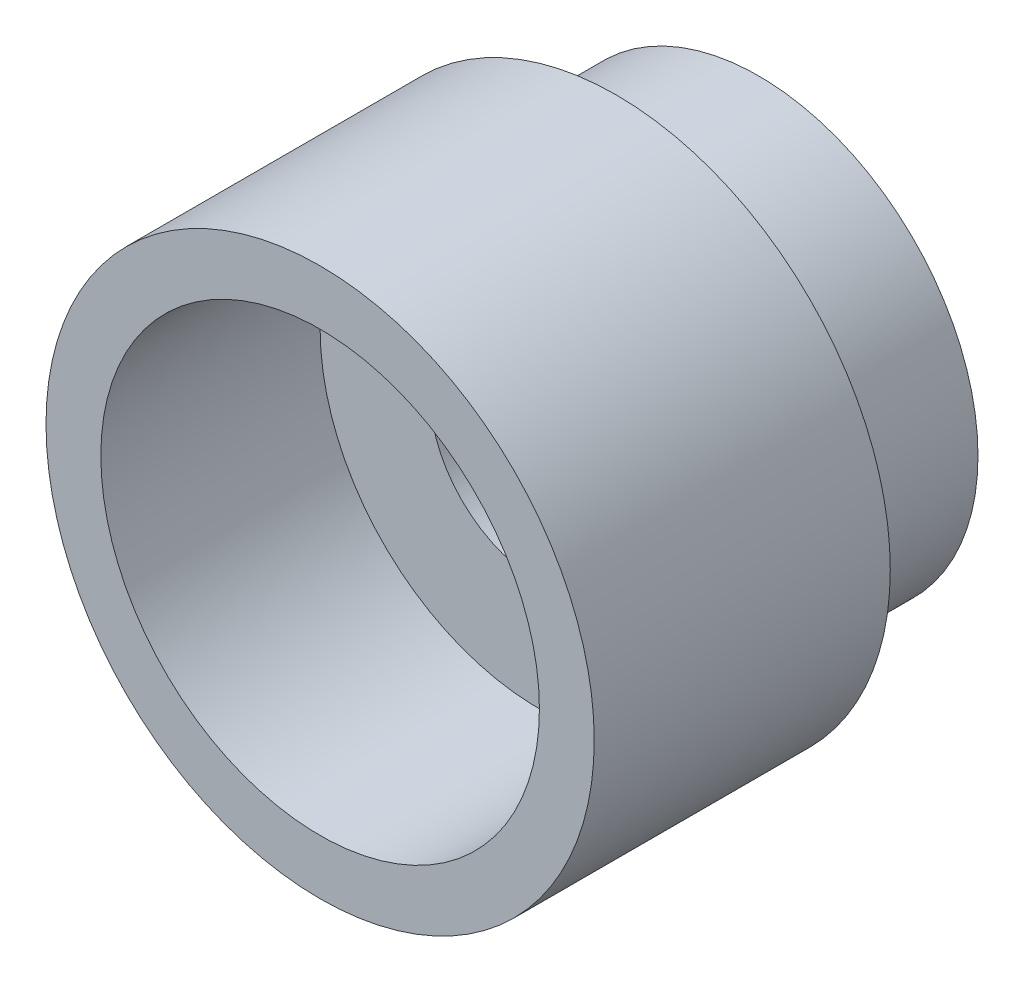
ISO-10303-21;
HEADER;
FILE_DESCRIPTION(('STEP AP214'),'2;1');
FILE_NAME('part.step','',(''),(''),'','','');
FILE_SCHEMA(('AUTOMOTIVE_DESIGN { 1 0 10303 214 1 1 1 1 }'));
ENDSEC;
DATA;
#1=APPLICATION_CONTEXT('core data for automotive mechanical design processes');
#2=APPLICATION_PROTOCOL_DEFINITION('international standard','automotive_design',2000,#1);
#3=PRODUCT_CONTEXT('',#1,'mechanical');
#4=PRODUCT('Part','Part','',(#3));
#5=PRODUCT_RELATED_PRODUCT_CATEGORY('part','',(#4));
#6=PRODUCT_DEFINITION_FORMATION('','',#4);
#7=PRODUCT_DEFINITION_CONTEXT('part definition',#1,'design');
#8=PRODUCT_DEFINITION('design','',#6,#7);
#9=PRODUCT_DEFINITION_SHAPE('','',#8);
#10=(LENGTH_UNIT() NAMED_UNIT(*) SI_UNIT(.MILLI.,.METRE.));
#11=(NAMED_UNIT(*) PLANE_ANGLE_UNIT() SI_UNIT($,.RADIAN.));
#12=(NAMED_UNIT(*) SI_UNIT($,.STERADIAN.) SOLID_ANGLE_UNIT());
#13=UNCERTAINTY_MEASURE_WITH_UNIT(LENGTH_MEASURE(1.E-05),#10,'distance_accuracy_value','');
#14=(GEOMETRIC_REPRESENTATION_CONTEXT(3) GLOBAL_UNCERTAINTY_ASSIGNED_CONTEXT((#13)) GLOBAL_UNIT_ASSIGNED_CONTEXT((#10,
#11,#12)) REPRESENTATION_CONTEXT('',''));
#15=CARTESIAN_POINT('',(0.,0.,0.));
#16=DIRECTION('',(0.,0.,1.));
#17=DIRECTION('',(1.,0.,0.));
#18=AXIS2_PLACEMENT_3D('',#15,#16,#17);
#19=CARTESIAN_POINT('',(0.,2.,0.));
#20=DIRECTION('',(0.,0.,-1.));
#21=DIRECTION('',(-1.,0.,0.));
#22=AXIS2_PLACEMENT_3D('',#19,#20,#21);
#23=PLANE('',#22);
#24=CARTESIAN_POINT('',(0.,0.,0.));
#25=DIRECTION('',(0.,0.,1.));
#26=DIRECTION('',(1.,0.,0.));
#27=AXIS2_PLACEMENT_3D('',#24,#25,#26);
#28=CIRCLE('',#27,2.);
#29=CARTESIAN_POINT('',(2.,0.,0.));
#30=VERTEX_POINT('',#29);
#31=EDGE_CURVE('E61',#30,#30,#28,.T.);
#32=ORIENTED_EDGE('',*,*,#31,.F.);
#33=EDGE_LOOP('',(#32));
#34=FACE_BOUND('',#33,.T.);
#35=CARTESIAN_POINT('',(0.,0.,0.));
#36=DIRECTION('',(0.,0.,1.));
#37=DIRECTION('',(1.,0.,0.));
#38=AXIS2_PLACEMENT_3D('',#35,#36,#37);
#39=CIRCLE('',#38,2.5);
#40=CARTESIAN_POINT('',(2.5,0.,0.));
#41=VERTEX_POINT('',#40);
#42=EDGE_CURVE('E10',#41,#41,#39,.T.);
#43=ORIENTED_EDGE('',*,*,#42,.T.);
#44=EDGE_LOOP('',(#43));
#45=FACE_BOUND('',#44,.T.);
#46=ADVANCED_FACE('F33',(#34,#45),#23,.F.);
#47=CARTESIAN_POINT('',(0.,0.,114.968048004561));
#48=DIRECTION('',(0.,0.,1.));
#49=DIRECTION('',(1.,0.,0.));
#50=AXIS2_PLACEMENT_3D('',#47,#48,#49);
#51=CYLINDRICAL_SURFACE('',#50,2.5);
#52=ORIENTED_EDGE('',*,*,#42,.F.);
#53=EDGE_LOOP('',(#52));
#54=FACE_BOUND('',#53,.T.);
#55=CARTESIAN_POINT('',(0.,0.,-2.69999999999999));
#56=DIRECTION('',(0.,0.,1.));
#57=DIRECTION('',(1.,0.,0.));
#58=AXIS2_PLACEMENT_3D('',#55,#56,#57);
#59=CIRCLE('',#58,2.5);
#60=CARTESIAN_POINT('',(2.5,0.,-2.69999999999999));
#61=VERTEX_POINT('',#60);
#62=EDGE_CURVE('E39',#61,#61,#59,.T.);
#63=ORIENTED_EDGE('',*,*,#62,.T.);
#64=EDGE_LOOP('',(#63));
#65=FACE_BOUND('',#64,.T.);
#66=ADVANCED_FACE('F68',(#54,#65),#51,.T.);
#67=CARTESIAN_POINT('',(0.,2.5,-2.7));
#68=DIRECTION('',(0.,0.,1.));
#69=DIRECTION('',(1.,0.,0.));
#70=AXIS2_PLACEMENT_3D('',#67,#68,#69);
#71=PLANE('',#70);
#72=ORIENTED_EDGE('',*,*,#62,.F.);
#73=EDGE_LOOP('',(#72));
#74=FACE_BOUND('',#73,.T.);
#75=CARTESIAN_POINT('',(0.,0.,-2.69999999999999));
#76=DIRECTION('',(0.,0.,1.));
#77=DIRECTION('',(1.,0.,0.));
#78=AXIS2_PLACEMENT_3D('',#75,#76,#77);
#79=CIRCLE('',#78,2.);
#80=CARTESIAN_POINT('',(2.,0.,-2.69999999999999));
#81=VERTEX_POINT('',#80);
#82=EDGE_CURVE('E43',#81,#81,#79,.T.);
#83=ORIENTED_EDGE('',*,*,#82,.T.);
#84=EDGE_LOOP('',(#83));
#85=FACE_BOUND('',#84,.T.);
#86=ADVANCED_FACE('F72',(#74,#85),#71,.F.);
#87=CARTESIAN_POINT('',(0.,0.,114.968048004561));
#88=DIRECTION('',(0.,0.,1.));
#89=DIRECTION('',(1.,0.,0.));
#90=AXIS2_PLACEMENT_3D('',#87,#88,#89);
#91=CYLINDRICAL_SURFACE('',#90,2.);
#92=ORIENTED_EDGE('',*,*,#82,.F.);
#93=EDGE_LOOP('',(#92));
#94=FACE_BOUND('',#93,.T.);
#95=CARTESIAN_POINT('',(0.,0.,-4.));
#96=DIRECTION('',(0.,0.,1.));
#97=DIRECTION('',(1.,0.,0.));
#98=AXIS2_PLACEMENT_3D('',#95,#96,#97);
#99=CIRCLE('',#98,2.);
#100=CARTESIAN_POINT('',(2.,0.,-4.));
#101=VERTEX_POINT('',#100);
#102=EDGE_CURVE('E47',#101,#101,#99,.T.);
#103=ORIENTED_EDGE('',*,*,#102,.T.);
#104=EDGE_LOOP('',(#103));
#105=FACE_BOUND('',#104,.T.);
#106=ADVANCED_FACE('F77',(#94,#105),#91,.T.);
#107=CARTESIAN_POINT('',(0.,2.,-4.));
#108=DIRECTION('',(0.,0.,1.));
#109=DIRECTION('',(1.,0.,0.));
#110=AXIS2_PLACEMENT_3D('',#107,#108,#109);
#111=PLANE('',#110);
#112=ORIENTED_EDGE('',*,*,#102,.F.);
#113=EDGE_LOOP('',(#112));
#114=FACE_BOUND('',#113,.T.);
#115=CARTESIAN_POINT('',(0.,0.,-4.));
#116=DIRECTION('',(0.,0.,1.));
#117=DIRECTION('',(1.,0.,0.));
#118=AXIS2_PLACEMENT_3D('',#115,#116,#117);
#119=CIRCLE('',#118,1.);
#120=CARTESIAN_POINT('',(1.,0.,-4.));
#121=VERTEX_POINT('',#120);
#122=EDGE_CURVE('E52',#121,#121,#119,.T.);
#123=ORIENTED_EDGE('',*,*,#122,.T.);
#124=EDGE_LOOP('',(#123));
#125=FACE_BOUND('',#124,.T.);
#126=ADVANCED_FACE('F83',(#114,#125),#111,.F.);
#127=CARTESIAN_POINT('',(0.,0.,114.968048004561));
#128=DIRECTION('',(0.,0.,1.));
#129=DIRECTION('',(1.,0.,0.));
#130=AXIS2_PLACEMENT_3D('',#127,#128,#129);
#131=CYLINDRICAL_SURFACE('',#130,1.);
#132=ORIENTED_EDGE('',*,*,#122,.F.);
#133=EDGE_LOOP('',(#132));
#134=FACE_BOUND('',#133,.T.);
#135=CARTESIAN_POINT('',(0.,0.,-2.));
#136=DIRECTION('',(0.,0.,1.));
#137=DIRECTION('',(1.,0.,0.));
#138=AXIS2_PLACEMENT_3D('',#135,#136,#137);
#139=CIRCLE('',#138,1.);
#140=CARTESIAN_POINT('',(1.,0.,-2.));
#141=VERTEX_POINT('',#140);
#142=EDGE_CURVE('E55',#141,#141,#139,.T.);
#143=ORIENTED_EDGE('',*,*,#142,.T.);
#144=EDGE_LOOP('',(#143));
#145=FACE_BOUND('',#144,.T.);
#146=ADVANCED_FACE('F87',(#134,#145),#131,.F.);
#147=CARTESIAN_POINT('',(0.,1.,-2.));
#148=DIRECTION('',(0.,0.,-1.));
#149=DIRECTION('',(-1.,0.,0.));
#150=AXIS2_PLACEMENT_3D('',#147,#148,#149);
#151=PLANE('',#150);
#152=ORIENTED_EDGE('',*,*,#142,.F.);
#153=EDGE_LOOP('',(#152));
#154=FACE_BOUND('',#153,.T.);
#155=CARTESIAN_POINT('',(0.,0.,-2.));
#156=DIRECTION('',(0.,0.,1.));
#157=DIRECTION('',(1.,0.,0.));
#158=AXIS2_PLACEMENT_3D('',#155,#156,#157);
#159=CIRCLE('',#158,2.);
#160=CARTESIAN_POINT('',(2.,0.,-2.));
#161=VERTEX_POINT('',#160);
#162=EDGE_CURVE('E58',#161,#161,#159,.T.);
#163=ORIENTED_EDGE('',*,*,#162,.T.);
#164=EDGE_LOOP('',(#163));
#165=FACE_BOUND('',#164,.T.);
#166=ADVANCED_FACE('F91',(#154,#165),#151,.F.);
#167=CARTESIAN_POINT('',(0.,0.,114.968048004561));
#168=DIRECTION('',(0.,0.,1.));
#169=DIRECTION('',(1.,0.,0.));
#170=AXIS2_PLACEMENT_3D('',#167,#168,#169);
#171=CYLINDRICAL_SURFACE('',#170,2.);
#172=ORIENTED_EDGE('',*,*,#162,.F.);
#173=EDGE_LOOP('',(#172));
#174=FACE_BOUND('',#173,.T.);
#175=ORIENTED_EDGE('',*,*,#31,.T.);
#176=EDGE_LOOP('',(#175));
#177=FACE_BOUND('',#176,.T.);
#178=ADVANCED_FACE('F65',(#174,#177),#171,.F.);
#179=CLOSED_SHELL('',(#46,#66,#86,#106,#126,#146,#166,#178));
#180=MANIFOLD_SOLID_BREP('B2',#179);
#181=ADVANCED_BREP_SHAPE_REPRESENTATION('',(#18,#180),#14);
#182=SHAPE_DEFINITION_REPRESENTATION(#9,#181);
ENDSEC;
END-ISO-10303-21;
